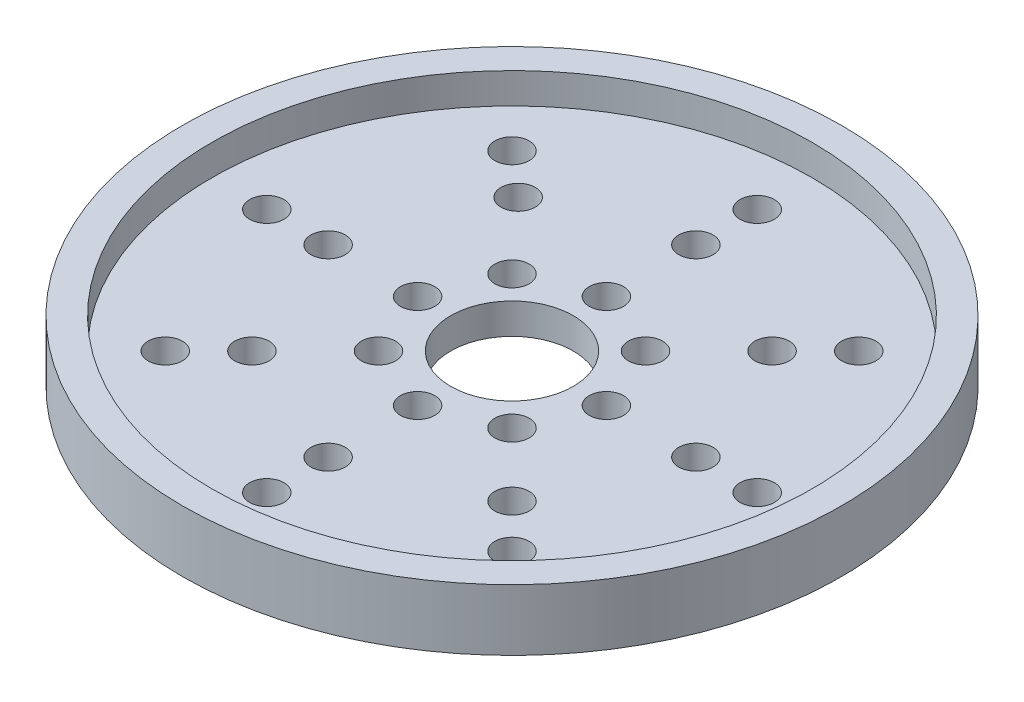
ISO-10303-21;
HEADER;
FILE_DESCRIPTION(('STEP AP214'),'2;1');
FILE_NAME('part.step','',(''),(''),'','','');
FILE_SCHEMA(('AUTOMOTIVE_DESIGN { 1 0 10303 214 1 1 1 1 }'));
ENDSEC;
DATA;
#1=APPLICATION_CONTEXT('core data for automotive mechanical design processes');
#2=APPLICATION_PROTOCOL_DEFINITION('international standard','automotive_design',2000,#1);
#3=PRODUCT_CONTEXT('',#1,'mechanical');
#4=PRODUCT('Part','Part','',(#3));
#5=PRODUCT_RELATED_PRODUCT_CATEGORY('part','',(#4));
#6=PRODUCT_DEFINITION_FORMATION('','',#4);
#7=PRODUCT_DEFINITION_CONTEXT('part definition',#1,'design');
#8=PRODUCT_DEFINITION('design','',#6,#7);
#9=PRODUCT_DEFINITION_SHAPE('','',#8);
#10=(LENGTH_UNIT() NAMED_UNIT(*) SI_UNIT(.MILLI.,.METRE.));
#11=(NAMED_UNIT(*) PLANE_ANGLE_UNIT() SI_UNIT($,.RADIAN.));
#12=(NAMED_UNIT(*) SI_UNIT($,.STERADIAN.) SOLID_ANGLE_UNIT());
#13=UNCERTAINTY_MEASURE_WITH_UNIT(LENGTH_MEASURE(1.E-05),#10,'distance_accuracy_value','');
#14=(GEOMETRIC_REPRESENTATION_CONTEXT(3) GLOBAL_UNCERTAINTY_ASSIGNED_CONTEXT((#13)) GLOBAL_UNIT_ASSIGNED_CONTEXT((#10,
#11,#12)) REPRESENTATION_CONTEXT('',''));
#15=CARTESIAN_POINT('',(0.,0.,0.));
#16=DIRECTION('',(0.,0.,1.));
#17=DIRECTION('',(1.,0.,0.));
#18=AXIS2_PLACEMENT_3D('',#15,#16,#17);
#19=CARTESIAN_POINT('',(0.,6.35,0.));
#20=DIRECTION('',(0.,-1.,0.));
#21=DIRECTION('',(0.,0.,-1.));
#22=AXIS2_PLACEMENT_3D('',#19,#20,#21);
#23=CYLINDRICAL_SURFACE('',#22,34.1376);
#24=CARTESIAN_POINT('',(0.,6.35,0.));
#25=DIRECTION('',(0.,1.,0.));
#26=DIRECTION('',(0.,0.,1.));
#27=AXIS2_PLACEMENT_3D('',#24,#25,#26);
#28=CIRCLE('',#27,34.1376);
#29=CARTESIAN_POINT('',(0.,6.35,34.1376));
#30=VERTEX_POINT('',#29);
#31=EDGE_CURVE('E10',#30,#30,#28,.T.);
#32=ORIENTED_EDGE('',*,*,#31,.F.);
#33=EDGE_LOOP('',(#32));
#34=FACE_BOUND('',#33,.T.);
#35=CARTESIAN_POINT('',(0.,0.,0.));
#36=DIRECTION('',(0.,1.,0.));
#37=DIRECTION('',(0.,0.,1.));
#38=AXIS2_PLACEMENT_3D('',#35,#36,#37);
#39=CIRCLE('',#38,34.1376);
#40=CARTESIAN_POINT('',(0.,0.,34.1376));
#41=VERTEX_POINT('',#40);
#42=EDGE_CURVE('E34',#41,#41,#39,.T.);
#43=ORIENTED_EDGE('',*,*,#42,.T.);
#44=EDGE_LOOP('',(#43));
#45=FACE_BOUND('',#44,.T.);
#46=ADVANCED_FACE('F31',(#34,#45),#23,.T.);
#47=CARTESIAN_POINT('',(0.,6.35,0.));
#48=DIRECTION('',(0.,1.,0.));
#49=DIRECTION('',(0.,0.,1.));
#50=AXIS2_PLACEMENT_3D('',#47,#48,#49);
#51=PLANE('',#50);
#52=CARTESIAN_POINT('',(0.,6.35,0.));
#53=DIRECTION('',(0.,1.,0.));
#54=DIRECTION('',(0.,0.,1.));
#55=AXIS2_PLACEMENT_3D('',#52,#53,#54);
#56=CIRCLE('',#55,31.0896);
#57=CARTESIAN_POINT('',(0.,6.35,31.0896));
#58=VERTEX_POINT('',#57);
#59=EDGE_CURVE('E43',#58,#58,#56,.T.);
#60=ORIENTED_EDGE('',*,*,#59,.F.);
#61=EDGE_LOOP('',(#60));
#62=FACE_BOUND('',#61,.T.);
#63=ORIENTED_EDGE('',*,*,#31,.T.);
#64=EDGE_LOOP('',(#63));
#65=FACE_BOUND('',#64,.T.);
#66=ADVANCED_FACE('F270',(#62,#65),#51,.T.);
#67=CARTESIAN_POINT('',(0.,0.,0.));
#68=DIRECTION('',(0.,1.,0.));
#69=DIRECTION('',(0.,0.,1.));
#70=AXIS2_PLACEMENT_3D('',#67,#68,#69);
#71=PLANE('',#70);
#72=CARTESIAN_POINT('',(6.91479721322325,0.,6.91479721322325));
#73=DIRECTION('',(0.,1.,0.));
#74=DIRECTION('',(0.,0.,1.));
#75=AXIS2_PLACEMENT_3D('',#72,#73,#74);
#76=CIRCLE('',#75,1.778);
#77=CARTESIAN_POINT('',(6.91479721322325,0.,8.69279721322325));
#78=VERTEX_POINT('',#77);
#79=EDGE_CURVE('E190',#78,#78,#76,.T.);
#80=ORIENTED_EDGE('',*,*,#79,.T.);
#81=EDGE_LOOP('',(#80));
#82=FACE_BOUND('',#81,.T.);
#83=CARTESIAN_POINT('',(0.,0.,9.779));
#84=DIRECTION('',(0.,1.,0.));
#85=DIRECTION('',(0.,0.,1.));
#86=AXIS2_PLACEMENT_3D('',#83,#84,#85);
#87=CIRCLE('',#86,1.778);
#88=CARTESIAN_POINT('',(0.,0.,11.557));
#89=VERTEX_POINT('',#88);
#90=EDGE_CURVE('E184',#89,#89,#87,.T.);
#91=ORIENTED_EDGE('',*,*,#90,.T.);
#92=EDGE_LOOP('',(#91));
#93=FACE_BOUND('',#92,.T.);
#94=CARTESIAN_POINT('',(-6.91479721322325,0.,6.91479721322325));
#95=DIRECTION('',(0.,1.,0.));
#96=DIRECTION('',(0.,0.,1.));
#97=AXIS2_PLACEMENT_3D('',#94,#95,#96);
#98=CIRCLE('',#97,1.778);
#99=CARTESIAN_POINT('',(-6.91479721322325,0.,8.69279721322325));
#100=VERTEX_POINT('',#99);
#101=EDGE_CURVE('E178',#100,#100,#98,.T.);
#102=ORIENTED_EDGE('',*,*,#101,.T.);
#103=EDGE_LOOP('',(#102));
#104=FACE_BOUND('',#103,.T.);
#105=CARTESIAN_POINT('',(-9.779,0.,0.));
#106=DIRECTION('',(0.,1.,0.));
#107=DIRECTION('',(0.,0.,1.));
#108=AXIS2_PLACEMENT_3D('',#105,#106,#107);
#109=CIRCLE('',#108,1.778);
#110=CARTESIAN_POINT('',(-9.779,0.,1.778));
#111=VERTEX_POINT('',#110);
#112=EDGE_CURVE('E172',#111,#111,#109,.T.);
#113=ORIENTED_EDGE('',*,*,#112,.T.);
#114=EDGE_LOOP('',(#113));
#115=FACE_BOUND('',#114,.T.);
#116=CARTESIAN_POINT('',(-6.91479721322325,0.,-6.91479721322325));
#117=DIRECTION('',(0.,1.,0.));
#118=DIRECTION('',(0.,0.,1.));
#119=AXIS2_PLACEMENT_3D('',#116,#117,#118);
#120=CIRCLE('',#119,1.778);
#121=CARTESIAN_POINT('',(-6.91479721322325,0.,-5.13679721322325));
#122=VERTEX_POINT('',#121);
#123=EDGE_CURVE('E166',#122,#122,#120,.T.);
#124=ORIENTED_EDGE('',*,*,#123,.T.);
#125=EDGE_LOOP('',(#124));
#126=FACE_BOUND('',#125,.T.);
#127=CARTESIAN_POINT('',(0.,0.,-9.779));
#128=DIRECTION('',(0.,1.,0.));
#129=DIRECTION('',(0.,0.,1.));
#130=AXIS2_PLACEMENT_3D('',#127,#128,#129);
#131=CIRCLE('',#130,1.778);
#132=CARTESIAN_POINT('',(0.,0.,-8.001));
#133=VERTEX_POINT('',#132);
#134=EDGE_CURVE('E160',#133,#133,#131,.T.);
#135=ORIENTED_EDGE('',*,*,#134,.T.);
#136=EDGE_LOOP('',(#135));
#137=FACE_BOUND('',#136,.T.);
#138=CARTESIAN_POINT('',(6.91479721322325,0.,-6.91479721322325));
#139=DIRECTION('',(0.,1.,0.));
#140=DIRECTION('',(0.,0.,1.));
#141=AXIS2_PLACEMENT_3D('',#138,#139,#140);
#142=CIRCLE('',#141,1.778);
#143=CARTESIAN_POINT('',(6.91479721322325,0.,-5.13679721322325));
#144=VERTEX_POINT('',#143);
#145=EDGE_CURVE('E154',#144,#144,#142,.T.);
#146=ORIENTED_EDGE('',*,*,#145,.T.);
#147=EDGE_LOOP('',(#146));
#148=FACE_BOUND('',#147,.T.);
#149=CARTESIAN_POINT('',(9.779,0.,0.));
#150=DIRECTION('',(0.,1.,0.));
#151=DIRECTION('',(0.,0.,1.));
#152=AXIS2_PLACEMENT_3D('',#149,#150,#151);
#153=CIRCLE('',#152,1.778);
#154=CARTESIAN_POINT('',(9.779,0.,1.778));
#155=VERTEX_POINT('',#154);
#156=EDGE_CURVE('E148',#155,#155,#153,.T.);
#157=ORIENTED_EDGE('',*,*,#156,.T.);
#158=EDGE_LOOP('',(#157));
#159=FACE_BOUND('',#158,.T.);
#160=CARTESIAN_POINT('',(13.4703841816037,0.,-13.4703841816037));
#161=DIRECTION('',(0.,1.,0.));
#162=DIRECTION('',(0.,0.,1.));
#163=AXIS2_PLACEMENT_3D('',#160,#161,#162);
#164=CIRCLE('',#163,1.778);
#165=CARTESIAN_POINT('',(13.4703841816037,0.,-11.6923841816037));
#166=VERTEX_POINT('',#165);
#167=EDGE_CURVE('E142',#166,#166,#164,.T.);
#168=ORIENTED_EDGE('',*,*,#167,.T.);
#169=EDGE_LOOP('',(#168));
#170=FACE_BOUND('',#169,.T.);
#171=CARTESIAN_POINT('',(19.05,0.,0.));
#172=DIRECTION('',(0.,1.,0.));
#173=DIRECTION('',(0.,0.,1.));
#174=AXIS2_PLACEMENT_3D('',#171,#172,#173);
#175=CIRCLE('',#174,1.778);
#176=CARTESIAN_POINT('',(19.05,0.,1.778));
#177=VERTEX_POINT('',#176);
#178=EDGE_CURVE('E136',#177,#177,#175,.T.);
#179=ORIENTED_EDGE('',*,*,#178,.T.);
#180=EDGE_LOOP('',(#179));
#181=FACE_BOUND('',#180,.T.);
#182=CARTESIAN_POINT('',(13.4703841816037,0.,13.4703841816037));
#183=DIRECTION('',(0.,1.,0.));
#184=DIRECTION('',(0.,0.,1.));
#185=AXIS2_PLACEMENT_3D('',#182,#183,#184);
#186=CIRCLE('',#185,1.778);
#187=CARTESIAN_POINT('',(13.4703841816037,0.,15.2483841816037));
#188=VERTEX_POINT('',#187);
#189=EDGE_CURVE('E130',#188,#188,#186,.T.);
#190=ORIENTED_EDGE('',*,*,#189,.T.);
#191=EDGE_LOOP('',(#190));
#192=FACE_BOUND('',#191,.T.);
#193=CARTESIAN_POINT('',(0.,0.,19.05));
#194=DIRECTION('',(0.,1.,0.));
#195=DIRECTION('',(0.,0.,1.));
#196=AXIS2_PLACEMENT_3D('',#193,#194,#195);
#197=CIRCLE('',#196,1.778);
#198=CARTESIAN_POINT('',(0.,0.,20.828));
#199=VERTEX_POINT('',#198);
#200=EDGE_CURVE('E124',#199,#199,#197,.T.);
#201=ORIENTED_EDGE('',*,*,#200,.T.);
#202=EDGE_LOOP('',(#201));
#203=FACE_BOUND('',#202,.T.);
#204=CARTESIAN_POINT('',(-13.4703841816037,0.,13.4703841816037));
#205=DIRECTION('',(0.,1.,0.));
#206=DIRECTION('',(0.,0.,1.));
#207=AXIS2_PLACEMENT_3D('',#204,#205,#206);
#208=CIRCLE('',#207,1.778);
#209=CARTESIAN_POINT('',(-13.4703841816037,0.,15.2483841816037));
#210=VERTEX_POINT('',#209);
#211=EDGE_CURVE('E118',#210,#210,#208,.T.);
#212=ORIENTED_EDGE('',*,*,#211,.T.);
#213=EDGE_LOOP('',(#212));
#214=FACE_BOUND('',#213,.T.);
#215=CARTESIAN_POINT('',(-19.05,0.,0.));
#216=DIRECTION('',(0.,1.,0.));
#217=DIRECTION('',(0.,0.,1.));
#218=AXIS2_PLACEMENT_3D('',#215,#216,#217);
#219=CIRCLE('',#218,1.778);
#220=CARTESIAN_POINT('',(-19.05,0.,1.778));
#221=VERTEX_POINT('',#220);
#222=EDGE_CURVE('E112',#221,#221,#219,.T.);
#223=ORIENTED_EDGE('',*,*,#222,.T.);
#224=EDGE_LOOP('',(#223));
#225=FACE_BOUND('',#224,.T.);
#226=CARTESIAN_POINT('',(-13.4703841816037,0.,-14.1089661095624));
#227=DIRECTION('',(0.,1.,0.));
#228=DIRECTION('',(0.,0.,1.));
#229=AXIS2_PLACEMENT_3D('',#226,#227,#228);
#230=CIRCLE('',#229,1.778);
#231=CARTESIAN_POINT('',(-13.4703841816037,0.,-12.3309661095624));
#232=VERTEX_POINT('',#231);
#233=EDGE_CURVE('E106',#232,#232,#230,.T.);
#234=ORIENTED_EDGE('',*,*,#233,.T.);
#235=EDGE_LOOP('',(#234));
#236=FACE_BOUND('',#235,.T.);
#237=CARTESIAN_POINT('',(0.,0.,-19.05));
#238=DIRECTION('',(0.,1.,0.));
#239=DIRECTION('',(0.,0.,1.));
#240=AXIS2_PLACEMENT_3D('',#237,#238,#239);
#241=CIRCLE('',#240,1.778);
#242=CARTESIAN_POINT('',(0.,0.,-17.272));
#243=VERTEX_POINT('',#242);
#244=EDGE_CURVE('E100',#243,#243,#241,.T.);
#245=ORIENTED_EDGE('',*,*,#244,.T.);
#246=EDGE_LOOP('',(#245));
#247=FACE_BOUND('',#246,.T.);
#248=CARTESIAN_POINT('',(17.9605122421383,0.,17.9605122421383));
#249=DIRECTION('',(0.,1.,0.));
#250=DIRECTION('',(0.,0.,1.));
#251=AXIS2_PLACEMENT_3D('',#248,#249,#250);
#252=CIRCLE('',#251,1.778);
#253=CARTESIAN_POINT('',(17.9605122421383,0.,19.7385122421383));
#254=VERTEX_POINT('',#253);
#255=EDGE_CURVE('E94',#254,#254,#252,.T.);
#256=ORIENTED_EDGE('',*,*,#255,.T.);
#257=EDGE_LOOP('',(#256));
#258=FACE_BOUND('',#257,.T.);
#259=CARTESIAN_POINT('',(0.,0.,25.4));
#260=DIRECTION('',(0.,1.,0.));
#261=DIRECTION('',(0.,0.,1.));
#262=AXIS2_PLACEMENT_3D('',#259,#260,#261);
#263=CIRCLE('',#262,1.778);
#264=CARTESIAN_POINT('',(0.,0.,27.178));
#265=VERTEX_POINT('',#264);
#266=EDGE_CURVE('E88',#265,#265,#263,.T.);
#267=ORIENTED_EDGE('',*,*,#266,.T.);
#268=EDGE_LOOP('',(#267));
#269=FACE_BOUND('',#268,.T.);
#270=CARTESIAN_POINT('',(-17.9605122421383,0.,17.9605122421383));
#271=DIRECTION('',(0.,1.,0.));
#272=DIRECTION('',(0.,0.,1.));
#273=AXIS2_PLACEMENT_3D('',#270,#271,#272);
#274=CIRCLE('',#273,1.778);
#275=CARTESIAN_POINT('',(-17.9605122421383,0.,19.7385122421383));
#276=VERTEX_POINT('',#275);
#277=EDGE_CURVE('E82',#276,#276,#274,.T.);
#278=ORIENTED_EDGE('',*,*,#277,.T.);
#279=EDGE_LOOP('',(#278));
#280=FACE_BOUND('',#279,.T.);
#281=CARTESIAN_POINT('',(-25.4,0.,0.));
#282=DIRECTION('',(0.,1.,0.));
#283=DIRECTION('',(0.,0.,1.));
#284=AXIS2_PLACEMENT_3D('',#281,#282,#283);
#285=CIRCLE('',#284,1.778);
#286=CARTESIAN_POINT('',(-25.4,0.,1.77800000000001));
#287=VERTEX_POINT('',#286);
#288=EDGE_CURVE('E76',#287,#287,#285,.T.);
#289=ORIENTED_EDGE('',*,*,#288,.T.);
#290=EDGE_LOOP('',(#289));
#291=FACE_BOUND('',#290,.T.);
#292=CARTESIAN_POINT('',(-17.9605122421383,0.,-17.9605122421383));
#293=DIRECTION('',(0.,1.,0.));
#294=DIRECTION('',(0.,0.,1.));
#295=AXIS2_PLACEMENT_3D('',#292,#293,#294);
#296=CIRCLE('',#295,1.778);
#297=CARTESIAN_POINT('',(-17.9605122421383,0.,-16.1825122421383));
#298=VERTEX_POINT('',#297);
#299=EDGE_CURVE('E70',#298,#298,#296,.T.);
#300=ORIENTED_EDGE('',*,*,#299,.T.);
#301=EDGE_LOOP('',(#300));
#302=FACE_BOUND('',#301,.T.);
#303=CARTESIAN_POINT('',(0.,0.,-25.4));
#304=DIRECTION('',(0.,1.,0.));
#305=DIRECTION('',(0.,0.,1.));
#306=AXIS2_PLACEMENT_3D('',#303,#304,#305);
#307=CIRCLE('',#306,1.778);
#308=CARTESIAN_POINT('',(0.,0.,-23.622));
#309=VERTEX_POINT('',#308);
#310=EDGE_CURVE('E64',#309,#309,#307,.T.);
#311=ORIENTED_EDGE('',*,*,#310,.T.);
#312=EDGE_LOOP('',(#311));
#313=FACE_BOUND('',#312,.T.);
#314=CARTESIAN_POINT('',(17.9605122421383,0.,-17.9605122421383));
#315=DIRECTION('',(0.,1.,0.));
#316=DIRECTION('',(0.,0.,1.));
#317=AXIS2_PLACEMENT_3D('',#314,#315,#316);
#318=CIRCLE('',#317,1.778);
#319=CARTESIAN_POINT('',(17.9605122421383,0.,-16.1825122421383));
#320=VERTEX_POINT('',#319);
#321=EDGE_CURVE('E58',#320,#320,#318,.T.);
#322=ORIENTED_EDGE('',*,*,#321,.T.);
#323=EDGE_LOOP('',(#322));
#324=FACE_BOUND('',#323,.T.);
#325=CARTESIAN_POINT('',(25.4,0.,0.));
#326=DIRECTION('',(0.,1.,0.));
#327=DIRECTION('',(0.,0.,1.));
#328=AXIS2_PLACEMENT_3D('',#325,#326,#327);
#329=CIRCLE('',#328,1.778);
#330=CARTESIAN_POINT('',(25.4,0.,1.778));
#331=VERTEX_POINT('',#330);
#332=EDGE_CURVE('E52',#331,#331,#329,.T.);
#333=ORIENTED_EDGE('',*,*,#332,.T.);
#334=EDGE_LOOP('',(#333));
#335=FACE_BOUND('',#334,.T.);
#336=CARTESIAN_POINT('',(0.,0.,0.));
#337=DIRECTION('',(0.,1.,0.));
#338=DIRECTION('',(0.,0.,1.));
#339=AXIS2_PLACEMENT_3D('',#336,#337,#338);
#340=CIRCLE('',#339,6.35);
#341=CARTESIAN_POINT('',(0.,0.,6.35));
#342=VERTEX_POINT('',#341);
#343=EDGE_CURVE('E46',#342,#342,#340,.T.);
#344=ORIENTED_EDGE('',*,*,#343,.T.);
#345=EDGE_LOOP('',(#344));
#346=FACE_BOUND('',#345,.T.);
#347=ORIENTED_EDGE('',*,*,#42,.F.);
#348=EDGE_LOOP('',(#347));
#349=FACE_BOUND('',#348,.T.);
#350=ADVANCED_FACE('F199',(#82,#93,#104,#115,#126,#137,#148,#159,#170,#181,#192,#203,#214,#225,
#236,#247,#258,#269,#280,#291,#302,#313,#324,#335,#346,#349),#71,.F.);
#351=CARTESIAN_POINT('',(0.,3.175,0.));
#352=DIRECTION('',(0.,1.,0.));
#353=DIRECTION('',(0.,0.,1.));
#354=AXIS2_PLACEMENT_3D('',#351,#352,#353);
#355=CYLINDRICAL_SURFACE('',#354,31.0896);
#356=CARTESIAN_POINT('',(0.,3.175,0.));
#357=DIRECTION('',(0.,1.,0.));
#358=DIRECTION('',(0.,0.,1.));
#359=AXIS2_PLACEMENT_3D('',#356,#357,#358);
#360=CIRCLE('',#359,31.0896);
#361=CARTESIAN_POINT('',(0.,3.175,31.0896));
#362=VERTEX_POINT('',#361);
#363=EDGE_CURVE('E41',#362,#362,#360,.T.);
#364=ORIENTED_EDGE('',*,*,#363,.F.);
#365=EDGE_LOOP('',(#364));
#366=FACE_BOUND('',#365,.T.);
#367=ORIENTED_EDGE('',*,*,#59,.T.);
#368=EDGE_LOOP('',(#367));
#369=FACE_BOUND('',#368,.T.);
#370=ADVANCED_FACE('F213',(#366,#369),#355,.F.);
#371=CARTESIAN_POINT('',(0.,3.175,0.));
#372=DIRECTION('',(0.,1.,0.));
#373=DIRECTION('',(0.,0.,1.));
#374=AXIS2_PLACEMENT_3D('',#371,#372,#373);
#375=PLANE('',#374);
#376=CARTESIAN_POINT('',(6.91479721322325,3.175,6.91479721322325));
#377=DIRECTION('',(0.,1.,0.));
#378=DIRECTION('',(0.,0.,1.));
#379=AXIS2_PLACEMENT_3D('',#376,#377,#378);
#380=CIRCLE('',#379,1.778);
#381=CARTESIAN_POINT('',(6.91479721322325,3.175,8.69279721322325));
#382=VERTEX_POINT('',#381);
#383=EDGE_CURVE('E193',#382,#382,#380,.T.);
#384=ORIENTED_EDGE('',*,*,#383,.F.);
#385=EDGE_LOOP('',(#384));
#386=FACE_BOUND('',#385,.T.);
#387=CARTESIAN_POINT('',(0.,3.175,9.779));
#388=DIRECTION('',(0.,1.,0.));
#389=DIRECTION('',(0.,0.,1.));
#390=AXIS2_PLACEMENT_3D('',#387,#388,#389);
#391=CIRCLE('',#390,1.778);
#392=CARTESIAN_POINT('',(0.,3.175,11.557));
#393=VERTEX_POINT('',#392);
#394=EDGE_CURVE('E187',#393,#393,#391,.T.);
#395=ORIENTED_EDGE('',*,*,#394,.F.);
#396=EDGE_LOOP('',(#395));
#397=FACE_BOUND('',#396,.T.);
#398=CARTESIAN_POINT('',(-6.91479721322325,3.175,6.91479721322325));
#399=DIRECTION('',(0.,1.,0.));
#400=DIRECTION('',(0.,0.,1.));
#401=AXIS2_PLACEMENT_3D('',#398,#399,#400);
#402=CIRCLE('',#401,1.778);
#403=CARTESIAN_POINT('',(-6.91479721322325,3.175,8.69279721322325));
#404=VERTEX_POINT('',#403);
#405=EDGE_CURVE('E181',#404,#404,#402,.T.);
#406=ORIENTED_EDGE('',*,*,#405,.F.);
#407=EDGE_LOOP('',(#406));
#408=FACE_BOUND('',#407,.T.);
#409=CARTESIAN_POINT('',(-9.779,3.175,0.));
#410=DIRECTION('',(0.,1.,0.));
#411=DIRECTION('',(0.,0.,1.));
#412=AXIS2_PLACEMENT_3D('',#409,#410,#411);
#413=CIRCLE('',#412,1.778);
#414=CARTESIAN_POINT('',(-9.779,3.175,1.778));
#415=VERTEX_POINT('',#414);
#416=EDGE_CURVE('E175',#415,#415,#413,.T.);
#417=ORIENTED_EDGE('',*,*,#416,.F.);
#418=EDGE_LOOP('',(#417));
#419=FACE_BOUND('',#418,.T.);
#420=CARTESIAN_POINT('',(-6.91479721322325,3.175,-6.91479721322325));
#421=DIRECTION('',(0.,1.,0.));
#422=DIRECTION('',(0.,0.,1.));
#423=AXIS2_PLACEMENT_3D('',#420,#421,#422);
#424=CIRCLE('',#423,1.778);
#425=CARTESIAN_POINT('',(-6.91479721322325,3.175,-5.13679721322325));
#426=VERTEX_POINT('',#425);
#427=EDGE_CURVE('E169',#426,#426,#424,.T.);
#428=ORIENTED_EDGE('',*,*,#427,.F.);
#429=EDGE_LOOP('',(#428));
#430=FACE_BOUND('',#429,.T.);
#431=CARTESIAN_POINT('',(0.,3.175,-9.779));
#432=DIRECTION('',(0.,1.,0.));
#433=DIRECTION('',(0.,0.,1.));
#434=AXIS2_PLACEMENT_3D('',#431,#432,#433);
#435=CIRCLE('',#434,1.778);
#436=CARTESIAN_POINT('',(0.,3.175,-8.001));
#437=VERTEX_POINT('',#436);
#438=EDGE_CURVE('E163',#437,#437,#435,.T.);
#439=ORIENTED_EDGE('',*,*,#438,.F.);
#440=EDGE_LOOP('',(#439));
#441=FACE_BOUND('',#440,.T.);
#442=CARTESIAN_POINT('',(6.91479721322325,3.175,-6.91479721322325));
#443=DIRECTION('',(0.,1.,0.));
#444=DIRECTION('',(0.,0.,1.));
#445=AXIS2_PLACEMENT_3D('',#442,#443,#444);
#446=CIRCLE('',#445,1.778);
#447=CARTESIAN_POINT('',(6.91479721322325,3.175,-5.13679721322325));
#448=VERTEX_POINT('',#447);
#449=EDGE_CURVE('E157',#448,#448,#446,.T.);
#450=ORIENTED_EDGE('',*,*,#449,.F.);
#451=EDGE_LOOP('',(#450));
#452=FACE_BOUND('',#451,.T.);
#453=CARTESIAN_POINT('',(9.779,3.175,0.));
#454=DIRECTION('',(0.,1.,0.));
#455=DIRECTION('',(0.,0.,1.));
#456=AXIS2_PLACEMENT_3D('',#453,#454,#455);
#457=CIRCLE('',#456,1.778);
#458=CARTESIAN_POINT('',(9.779,3.175,1.778));
#459=VERTEX_POINT('',#458);
#460=EDGE_CURVE('E151',#459,#459,#457,.T.);
#461=ORIENTED_EDGE('',*,*,#460,.F.);
#462=EDGE_LOOP('',(#461));
#463=FACE_BOUND('',#462,.T.);
#464=CARTESIAN_POINT('',(13.4703841816037,3.175,-13.4703841816037));
#465=DIRECTION('',(0.,1.,0.));
#466=DIRECTION('',(0.,0.,1.));
#467=AXIS2_PLACEMENT_3D('',#464,#465,#466);
#468=CIRCLE('',#467,1.778);
#469=CARTESIAN_POINT('',(13.4703841816037,3.175,-11.6923841816037));
#470=VERTEX_POINT('',#469);
#471=EDGE_CURVE('E145',#470,#470,#468,.T.);
#472=ORIENTED_EDGE('',*,*,#471,.F.);
#473=EDGE_LOOP('',(#472));
#474=FACE_BOUND('',#473,.T.);
#475=CARTESIAN_POINT('',(19.05,3.175,0.));
#476=DIRECTION('',(0.,1.,0.));
#477=DIRECTION('',(0.,0.,1.));
#478=AXIS2_PLACEMENT_3D('',#475,#476,#477);
#479=CIRCLE('',#478,1.778);
#480=CARTESIAN_POINT('',(19.05,3.175,1.778));
#481=VERTEX_POINT('',#480);
#482=EDGE_CURVE('E139',#481,#481,#479,.T.);
#483=ORIENTED_EDGE('',*,*,#482,.F.);
#484=EDGE_LOOP('',(#483));
#485=FACE_BOUND('',#484,.T.);
#486=CARTESIAN_POINT('',(13.4703841816037,3.175,13.4703841816037));
#487=DIRECTION('',(0.,1.,0.));
#488=DIRECTION('',(0.,0.,1.));
#489=AXIS2_PLACEMENT_3D('',#486,#487,#488);
#490=CIRCLE('',#489,1.778);
#491=CARTESIAN_POINT('',(13.4703841816037,3.175,15.2483841816037));
#492=VERTEX_POINT('',#491);
#493=EDGE_CURVE('E133',#492,#492,#490,.T.);
#494=ORIENTED_EDGE('',*,*,#493,.F.);
#495=EDGE_LOOP('',(#494));
#496=FACE_BOUND('',#495,.T.);
#497=CARTESIAN_POINT('',(0.,3.175,19.05));
#498=DIRECTION('',(0.,1.,0.));
#499=DIRECTION('',(0.,0.,1.));
#500=AXIS2_PLACEMENT_3D('',#497,#498,#499);
#501=CIRCLE('',#500,1.778);
#502=CARTESIAN_POINT('',(0.,3.175,20.828));
#503=VERTEX_POINT('',#502);
#504=EDGE_CURVE('E127',#503,#503,#501,.T.);
#505=ORIENTED_EDGE('',*,*,#504,.F.);
#506=EDGE_LOOP('',(#505));
#507=FACE_BOUND('',#506,.T.);
#508=CARTESIAN_POINT('',(-13.4703841816037,3.175,13.4703841816037));
#509=DIRECTION('',(0.,1.,0.));
#510=DIRECTION('',(0.,0.,1.));
#511=AXIS2_PLACEMENT_3D('',#508,#509,#510);
#512=CIRCLE('',#511,1.778);
#513=CARTESIAN_POINT('',(-13.4703841816037,3.175,15.2483841816037));
#514=VERTEX_POINT('',#513);
#515=EDGE_CURVE('E121',#514,#514,#512,.T.);
#516=ORIENTED_EDGE('',*,*,#515,.F.);
#517=EDGE_LOOP('',(#516));
#518=FACE_BOUND('',#517,.T.);
#519=CARTESIAN_POINT('',(-19.05,3.175,0.));
#520=DIRECTION('',(0.,1.,0.));
#521=DIRECTION('',(0.,0.,1.));
#522=AXIS2_PLACEMENT_3D('',#519,#520,#521);
#523=CIRCLE('',#522,1.778);
#524=CARTESIAN_POINT('',(-19.05,3.175,1.778));
#525=VERTEX_POINT('',#524);
#526=EDGE_CURVE('E115',#525,#525,#523,.T.);
#527=ORIENTED_EDGE('',*,*,#526,.F.);
#528=EDGE_LOOP('',(#527));
#529=FACE_BOUND('',#528,.T.);
#530=CARTESIAN_POINT('',(-13.4703841816037,3.175,-14.1089661095624));
#531=DIRECTION('',(0.,1.,0.));
#532=DIRECTION('',(0.,0.,1.));
#533=AXIS2_PLACEMENT_3D('',#530,#531,#532);
#534=CIRCLE('',#533,1.778);
#535=CARTESIAN_POINT('',(-13.4703841816037,3.175,-12.3309661095624));
#536=VERTEX_POINT('',#535);
#537=EDGE_CURVE('E109',#536,#536,#534,.T.);
#538=ORIENTED_EDGE('',*,*,#537,.F.);
#539=EDGE_LOOP('',(#538));
#540=FACE_BOUND('',#539,.T.);
#541=CARTESIAN_POINT('',(0.,3.175,-19.05));
#542=DIRECTION('',(0.,1.,0.));
#543=DIRECTION('',(0.,0.,1.));
#544=AXIS2_PLACEMENT_3D('',#541,#542,#543);
#545=CIRCLE('',#544,1.778);
#546=CARTESIAN_POINT('',(0.,3.175,-17.272));
#547=VERTEX_POINT('',#546);
#548=EDGE_CURVE('E103',#547,#547,#545,.T.);
#549=ORIENTED_EDGE('',*,*,#548,.F.);
#550=EDGE_LOOP('',(#549));
#551=FACE_BOUND('',#550,.T.);
#552=CARTESIAN_POINT('',(17.9605122421383,3.175,17.9605122421383));
#553=DIRECTION('',(0.,1.,0.));
#554=DIRECTION('',(0.,0.,1.));
#555=AXIS2_PLACEMENT_3D('',#552,#553,#554);
#556=CIRCLE('',#555,1.778);
#557=CARTESIAN_POINT('',(17.9605122421383,3.175,19.7385122421383));
#558=VERTEX_POINT('',#557);
#559=EDGE_CURVE('E97',#558,#558,#556,.T.);
#560=ORIENTED_EDGE('',*,*,#559,.F.);
#561=EDGE_LOOP('',(#560));
#562=FACE_BOUND('',#561,.T.);
#563=CARTESIAN_POINT('',(0.,3.175,25.4));
#564=DIRECTION('',(0.,1.,0.));
#565=DIRECTION('',(0.,0.,1.));
#566=AXIS2_PLACEMENT_3D('',#563,#564,#565);
#567=CIRCLE('',#566,1.778);
#568=CARTESIAN_POINT('',(0.,3.175,27.178));
#569=VERTEX_POINT('',#568);
#570=EDGE_CURVE('E91',#569,#569,#567,.T.);
#571=ORIENTED_EDGE('',*,*,#570,.F.);
#572=EDGE_LOOP('',(#571));
#573=FACE_BOUND('',#572,.T.);
#574=CARTESIAN_POINT('',(-17.9605122421383,3.175,17.9605122421383));
#575=DIRECTION('',(0.,1.,0.));
#576=DIRECTION('',(0.,0.,1.));
#577=AXIS2_PLACEMENT_3D('',#574,#575,#576);
#578=CIRCLE('',#577,1.778);
#579=CARTESIAN_POINT('',(-17.9605122421383,3.175,19.7385122421383));
#580=VERTEX_POINT('',#579);
#581=EDGE_CURVE('E85',#580,#580,#578,.T.);
#582=ORIENTED_EDGE('',*,*,#581,.F.);
#583=EDGE_LOOP('',(#582));
#584=FACE_BOUND('',#583,.T.);
#585=CARTESIAN_POINT('',(-25.4,3.175,0.));
#586=DIRECTION('',(0.,1.,0.));
#587=DIRECTION('',(0.,0.,1.));
#588=AXIS2_PLACEMENT_3D('',#585,#586,#587);
#589=CIRCLE('',#588,1.778);
#590=CARTESIAN_POINT('',(-25.4,3.175,1.77800000000001));
#591=VERTEX_POINT('',#590);
#592=EDGE_CURVE('E79',#591,#591,#589,.T.);
#593=ORIENTED_EDGE('',*,*,#592,.F.);
#594=EDGE_LOOP('',(#593));
#595=FACE_BOUND('',#594,.T.);
#596=CARTESIAN_POINT('',(-17.9605122421383,3.175,-17.9605122421383));
#597=DIRECTION('',(0.,1.,0.));
#598=DIRECTION('',(0.,0.,1.));
#599=AXIS2_PLACEMENT_3D('',#596,#597,#598);
#600=CIRCLE('',#599,1.778);
#601=CARTESIAN_POINT('',(-17.9605122421383,3.175,-16.1825122421383));
#602=VERTEX_POINT('',#601);
#603=EDGE_CURVE('E73',#602,#602,#600,.T.);
#604=ORIENTED_EDGE('',*,*,#603,.F.);
#605=EDGE_LOOP('',(#604));
#606=FACE_BOUND('',#605,.T.);
#607=CARTESIAN_POINT('',(0.,3.175,-25.4));
#608=DIRECTION('',(0.,1.,0.));
#609=DIRECTION('',(0.,0.,1.));
#610=AXIS2_PLACEMENT_3D('',#607,#608,#609);
#611=CIRCLE('',#610,1.778);
#612=CARTESIAN_POINT('',(0.,3.175,-23.622));
#613=VERTEX_POINT('',#612);
#614=EDGE_CURVE('E67',#613,#613,#611,.T.);
#615=ORIENTED_EDGE('',*,*,#614,.F.);
#616=EDGE_LOOP('',(#615));
#617=FACE_BOUND('',#616,.T.);
#618=CARTESIAN_POINT('',(17.9605122421383,3.175,-17.9605122421383));
#619=DIRECTION('',(0.,1.,0.));
#620=DIRECTION('',(0.,0.,1.));
#621=AXIS2_PLACEMENT_3D('',#618,#619,#620);
#622=CIRCLE('',#621,1.778);
#623=CARTESIAN_POINT('',(17.9605122421383,3.175,-16.1825122421383));
#624=VERTEX_POINT('',#623);
#625=EDGE_CURVE('E61',#624,#624,#622,.T.);
#626=ORIENTED_EDGE('',*,*,#625,.F.);
#627=EDGE_LOOP('',(#626));
#628=FACE_BOUND('',#627,.T.);
#629=CARTESIAN_POINT('',(25.4,3.175,0.));
#630=DIRECTION('',(0.,1.,0.));
#631=DIRECTION('',(0.,0.,1.));
#632=AXIS2_PLACEMENT_3D('',#629,#630,#631);
#633=CIRCLE('',#632,1.778);
#634=CARTESIAN_POINT('',(25.4,3.175,1.778));
#635=VERTEX_POINT('',#634);
#636=EDGE_CURVE('E55',#635,#635,#633,.T.);
#637=ORIENTED_EDGE('',*,*,#636,.F.);
#638=EDGE_LOOP('',(#637));
#639=FACE_BOUND('',#638,.T.);
#640=CARTESIAN_POINT('',(0.,3.175,0.));
#641=DIRECTION('',(0.,1.,0.));
#642=DIRECTION('',(0.,0.,1.));
#643=AXIS2_PLACEMENT_3D('',#640,#641,#642);
#644=CIRCLE('',#643,6.35);
#645=CARTESIAN_POINT('',(0.,3.175,6.35));
#646=VERTEX_POINT('',#645);
#647=EDGE_CURVE('E49',#646,#646,#644,.T.);
#648=ORIENTED_EDGE('',*,*,#647,.F.);
#649=EDGE_LOOP('',(#648));
#650=FACE_BOUND('',#649,.T.);
#651=ORIENTED_EDGE('',*,*,#363,.T.);
#652=EDGE_LOOP('',(#651));
#653=FACE_BOUND('',#652,.T.);
#654=ADVANCED_FACE('F209',(#386,#397,#408,#419,#430,#441,#452,#463,#474,#485,#496,#507,#518,
#529,#540,#551,#562,#573,#584,#595,#606,#617,#628,#639,#650,#653),#375,.T.);
#655=CARTESIAN_POINT('',(0.,0.,0.));
#656=DIRECTION('',(0.,1.,0.));
#657=DIRECTION('',(0.,0.,1.));
#658=AXIS2_PLACEMENT_3D('',#655,#656,#657);
#659=CYLINDRICAL_SURFACE('',#658,6.35);
#660=ORIENTED_EDGE('',*,*,#343,.F.);
#661=EDGE_LOOP('',(#660));
#662=FACE_BOUND('',#661,.T.);
#663=ORIENTED_EDGE('',*,*,#647,.T.);
#664=EDGE_LOOP('',(#663));
#665=FACE_BOUND('',#664,.T.);
#666=ADVANCED_FACE('F212',(#662,#665),#659,.F.);
#667=CARTESIAN_POINT('',(25.4,0.,0.));
#668=DIRECTION('',(0.,1.,0.));
#669=DIRECTION('',(0.,0.,1.));
#670=AXIS2_PLACEMENT_3D('',#667,#668,#669);
#671=CYLINDRICAL_SURFACE('',#670,1.778);
#672=ORIENTED_EDGE('',*,*,#332,.F.);
#673=EDGE_LOOP('',(#672));
#674=FACE_BOUND('',#673,.T.);
#675=ORIENTED_EDGE('',*,*,#636,.T.);
#676=EDGE_LOOP('',(#675));
#677=FACE_BOUND('',#676,.T.);
#678=ADVANCED_FACE('F281',(#674,#677),#671,.F.);
#679=CARTESIAN_POINT('',(17.9605122421383,0.,-17.9605122421383));
#680=DIRECTION('',(0.,1.,0.));
#681=DIRECTION('',(0.,0.,1.));
#682=AXIS2_PLACEMENT_3D('',#679,#680,#681);
#683=CYLINDRICAL_SURFACE('',#682,1.778);
#684=ORIENTED_EDGE('',*,*,#321,.F.);
#685=EDGE_LOOP('',(#684));
#686=FACE_BOUND('',#685,.T.);
#687=ORIENTED_EDGE('',*,*,#625,.T.);
#688=EDGE_LOOP('',(#687));
#689=FACE_BOUND('',#688,.T.);
#690=ADVANCED_FACE('F285',(#686,#689),#683,.F.);
#691=CARTESIAN_POINT('',(0.,0.,-25.4));
#692=DIRECTION('',(0.,1.,0.));
#693=DIRECTION('',(0.,0.,1.));
#694=AXIS2_PLACEMENT_3D('',#691,#692,#693);
#695=CYLINDRICAL_SURFACE('',#694,1.778);
#696=ORIENTED_EDGE('',*,*,#310,.F.);
#697=EDGE_LOOP('',(#696));
#698=FACE_BOUND('',#697,.T.);
#699=ORIENTED_EDGE('',*,*,#614,.T.);
#700=EDGE_LOOP('',(#699));
#701=FACE_BOUND('',#700,.T.);
#702=ADVANCED_FACE('F289',(#698,#701),#695,.F.);
#703=CARTESIAN_POINT('',(-17.9605122421383,0.,-17.9605122421383));
#704=DIRECTION('',(0.,1.,0.));
#705=DIRECTION('',(0.,0.,1.));
#706=AXIS2_PLACEMENT_3D('',#703,#704,#705);
#707=CYLINDRICAL_SURFACE('',#706,1.778);
#708=ORIENTED_EDGE('',*,*,#299,.F.);
#709=EDGE_LOOP('',(#708));
#710=FACE_BOUND('',#709,.T.);
#711=ORIENTED_EDGE('',*,*,#603,.T.);
#712=EDGE_LOOP('',(#711));
#713=FACE_BOUND('',#712,.T.);
#714=ADVANCED_FACE('F293',(#710,#713),#707,.F.);
#715=CARTESIAN_POINT('',(-25.4,0.,0.));
#716=DIRECTION('',(0.,1.,0.));
#717=DIRECTION('',(0.,0.,1.));
#718=AXIS2_PLACEMENT_3D('',#715,#716,#717);
#719=CYLINDRICAL_SURFACE('',#718,1.778);
#720=ORIENTED_EDGE('',*,*,#288,.F.);
#721=EDGE_LOOP('',(#720));
#722=FACE_BOUND('',#721,.T.);
#723=ORIENTED_EDGE('',*,*,#592,.T.);
#724=EDGE_LOOP('',(#723));
#725=FACE_BOUND('',#724,.T.);
#726=ADVANCED_FACE('F297',(#722,#725),#719,.F.);
#727=CARTESIAN_POINT('',(-17.9605122421383,0.,17.9605122421383));
#728=DIRECTION('',(0.,1.,0.));
#729=DIRECTION('',(0.,0.,1.));
#730=AXIS2_PLACEMENT_3D('',#727,#728,#729);
#731=CYLINDRICAL_SURFACE('',#730,1.778);
#732=ORIENTED_EDGE('',*,*,#277,.F.);
#733=EDGE_LOOP('',(#732));
#734=FACE_BOUND('',#733,.T.);
#735=ORIENTED_EDGE('',*,*,#581,.T.);
#736=EDGE_LOOP('',(#735));
#737=FACE_BOUND('',#736,.T.);
#738=ADVANCED_FACE('F301',(#734,#737),#731,.F.);
#739=CARTESIAN_POINT('',(0.,0.,25.4));
#740=DIRECTION('',(0.,1.,0.));
#741=DIRECTION('',(0.,0.,1.));
#742=AXIS2_PLACEMENT_3D('',#739,#740,#741);
#743=CYLINDRICAL_SURFACE('',#742,1.778);
#744=ORIENTED_EDGE('',*,*,#266,.F.);
#745=EDGE_LOOP('',(#744));
#746=FACE_BOUND('',#745,.T.);
#747=ORIENTED_EDGE('',*,*,#570,.T.);
#748=EDGE_LOOP('',(#747));
#749=FACE_BOUND('',#748,.T.);
#750=ADVANCED_FACE('F305',(#746,#749),#743,.F.);
#751=CARTESIAN_POINT('',(17.9605122421383,0.,17.9605122421383));
#752=DIRECTION('',(0.,1.,0.));
#753=DIRECTION('',(0.,0.,1.));
#754=AXIS2_PLACEMENT_3D('',#751,#752,#753);
#755=CYLINDRICAL_SURFACE('',#754,1.778);
#756=ORIENTED_EDGE('',*,*,#255,.F.);
#757=EDGE_LOOP('',(#756));
#758=FACE_BOUND('',#757,.T.);
#759=ORIENTED_EDGE('',*,*,#559,.T.);
#760=EDGE_LOOP('',(#759));
#761=FACE_BOUND('',#760,.T.);
#762=ADVANCED_FACE('F309',(#758,#761),#755,.F.);
#763=CARTESIAN_POINT('',(0.,0.,-19.05));
#764=DIRECTION('',(0.,1.,0.));
#765=DIRECTION('',(0.,0.,1.));
#766=AXIS2_PLACEMENT_3D('',#763,#764,#765);
#767=CYLINDRICAL_SURFACE('',#766,1.778);
#768=ORIENTED_EDGE('',*,*,#244,.F.);
#769=EDGE_LOOP('',(#768));
#770=FACE_BOUND('',#769,.T.);
#771=ORIENTED_EDGE('',*,*,#548,.T.);
#772=EDGE_LOOP('',(#771));
#773=FACE_BOUND('',#772,.T.);
#774=ADVANCED_FACE('F313',(#770,#773),#767,.F.);
#775=CARTESIAN_POINT('',(-13.4703841816037,0.,-14.1089661095624));
#776=DIRECTION('',(0.,1.,0.));
#777=DIRECTION('',(0.,0.,1.));
#778=AXIS2_PLACEMENT_3D('',#775,#776,#777);
#779=CYLINDRICAL_SURFACE('',#778,1.778);
#780=ORIENTED_EDGE('',*,*,#233,.F.);
#781=EDGE_LOOP('',(#780));
#782=FACE_BOUND('',#781,.T.);
#783=ORIENTED_EDGE('',*,*,#537,.T.);
#784=EDGE_LOOP('',(#783));
#785=FACE_BOUND('',#784,.T.);
#786=ADVANCED_FACE('F317',(#782,#785),#779,.F.);
#787=CARTESIAN_POINT('',(-19.05,0.,0.));
#788=DIRECTION('',(0.,1.,0.));
#789=DIRECTION('',(0.,0.,1.));
#790=AXIS2_PLACEMENT_3D('',#787,#788,#789);
#791=CYLINDRICAL_SURFACE('',#790,1.778);
#792=ORIENTED_EDGE('',*,*,#222,.F.);
#793=EDGE_LOOP('',(#792));
#794=FACE_BOUND('',#793,.T.);
#795=ORIENTED_EDGE('',*,*,#526,.T.);
#796=EDGE_LOOP('',(#795));
#797=FACE_BOUND('',#796,.T.);
#798=ADVANCED_FACE('F321',(#794,#797),#791,.F.);
#799=CARTESIAN_POINT('',(-13.4703841816037,0.,13.4703841816037));
#800=DIRECTION('',(0.,1.,0.));
#801=DIRECTION('',(0.,0.,1.));
#802=AXIS2_PLACEMENT_3D('',#799,#800,#801);
#803=CYLINDRICAL_SURFACE('',#802,1.778);
#804=ORIENTED_EDGE('',*,*,#211,.F.);
#805=EDGE_LOOP('',(#804));
#806=FACE_BOUND('',#805,.T.);
#807=ORIENTED_EDGE('',*,*,#515,.T.);
#808=EDGE_LOOP('',(#807));
#809=FACE_BOUND('',#808,.T.);
#810=ADVANCED_FACE('F325',(#806,#809),#803,.F.);
#811=CARTESIAN_POINT('',(0.,0.,19.05));
#812=DIRECTION('',(0.,1.,0.));
#813=DIRECTION('',(0.,0.,1.));
#814=AXIS2_PLACEMENT_3D('',#811,#812,#813);
#815=CYLINDRICAL_SURFACE('',#814,1.778);
#816=ORIENTED_EDGE('',*,*,#200,.F.);
#817=EDGE_LOOP('',(#816));
#818=FACE_BOUND('',#817,.T.);
#819=ORIENTED_EDGE('',*,*,#504,.T.);
#820=EDGE_LOOP('',(#819));
#821=FACE_BOUND('',#820,.T.);
#822=ADVANCED_FACE('F329',(#818,#821),#815,.F.);
#823=CARTESIAN_POINT('',(13.4703841816037,0.,13.4703841816037));
#824=DIRECTION('',(0.,1.,0.));
#825=DIRECTION('',(0.,0.,1.));
#826=AXIS2_PLACEMENT_3D('',#823,#824,#825);
#827=CYLINDRICAL_SURFACE('',#826,1.778);
#828=ORIENTED_EDGE('',*,*,#189,.F.);
#829=EDGE_LOOP('',(#828));
#830=FACE_BOUND('',#829,.T.);
#831=ORIENTED_EDGE('',*,*,#493,.T.);
#832=EDGE_LOOP('',(#831));
#833=FACE_BOUND('',#832,.T.);
#834=ADVANCED_FACE('F333',(#830,#833),#827,.F.);
#835=CARTESIAN_POINT('',(19.05,0.,0.));
#836=DIRECTION('',(0.,1.,0.));
#837=DIRECTION('',(0.,0.,1.));
#838=AXIS2_PLACEMENT_3D('',#835,#836,#837);
#839=CYLINDRICAL_SURFACE('',#838,1.778);
#840=ORIENTED_EDGE('',*,*,#178,.F.);
#841=EDGE_LOOP('',(#840));
#842=FACE_BOUND('',#841,.T.);
#843=ORIENTED_EDGE('',*,*,#482,.T.);
#844=EDGE_LOOP('',(#843));
#845=FACE_BOUND('',#844,.T.);
#846=ADVANCED_FACE('F337',(#842,#845),#839,.F.);
#847=CARTESIAN_POINT('',(13.4703841816037,0.,-13.4703841816037));
#848=DIRECTION('',(0.,1.,0.));
#849=DIRECTION('',(0.,0.,1.));
#850=AXIS2_PLACEMENT_3D('',#847,#848,#849);
#851=CYLINDRICAL_SURFACE('',#850,1.778);
#852=ORIENTED_EDGE('',*,*,#167,.F.);
#853=EDGE_LOOP('',(#852));
#854=FACE_BOUND('',#853,.T.);
#855=ORIENTED_EDGE('',*,*,#471,.T.);
#856=EDGE_LOOP('',(#855));
#857=FACE_BOUND('',#856,.T.);
#858=ADVANCED_FACE('F341',(#854,#857),#851,.F.);
#859=CARTESIAN_POINT('',(9.779,0.,0.));
#860=DIRECTION('',(0.,1.,0.));
#861=DIRECTION('',(0.,0.,1.));
#862=AXIS2_PLACEMENT_3D('',#859,#860,#861);
#863=CYLINDRICAL_SURFACE('',#862,1.778);
#864=ORIENTED_EDGE('',*,*,#156,.F.);
#865=EDGE_LOOP('',(#864));
#866=FACE_BOUND('',#865,.T.);
#867=ORIENTED_EDGE('',*,*,#460,.T.);
#868=EDGE_LOOP('',(#867));
#869=FACE_BOUND('',#868,.T.);
#870=ADVANCED_FACE('F345',(#866,#869),#863,.F.);
#871=CARTESIAN_POINT('',(6.91479721322325,0.,-6.91479721322325));
#872=DIRECTION('',(0.,1.,0.));
#873=DIRECTION('',(0.,0.,1.));
#874=AXIS2_PLACEMENT_3D('',#871,#872,#873);
#875=CYLINDRICAL_SURFACE('',#874,1.778);
#876=ORIENTED_EDGE('',*,*,#145,.F.);
#877=EDGE_LOOP('',(#876));
#878=FACE_BOUND('',#877,.T.);
#879=ORIENTED_EDGE('',*,*,#449,.T.);
#880=EDGE_LOOP('',(#879));
#881=FACE_BOUND('',#880,.T.);
#882=ADVANCED_FACE('F349',(#878,#881),#875,.F.);
#883=CARTESIAN_POINT('',(0.,0.,-9.779));
#884=DIRECTION('',(0.,1.,0.));
#885=DIRECTION('',(0.,0.,1.));
#886=AXIS2_PLACEMENT_3D('',#883,#884,#885);
#887=CYLINDRICAL_SURFACE('',#886,1.778);
#888=ORIENTED_EDGE('',*,*,#134,.F.);
#889=EDGE_LOOP('',(#888));
#890=FACE_BOUND('',#889,.T.);
#891=ORIENTED_EDGE('',*,*,#438,.T.);
#892=EDGE_LOOP('',(#891));
#893=FACE_BOUND('',#892,.T.);
#894=ADVANCED_FACE('F353',(#890,#893),#887,.F.);
#895=CARTESIAN_POINT('',(-6.91479721322325,0.,-6.91479721322325));
#896=DIRECTION('',(0.,1.,0.));
#897=DIRECTION('',(0.,0.,1.));
#898=AXIS2_PLACEMENT_3D('',#895,#896,#897);
#899=CYLINDRICAL_SURFACE('',#898,1.778);
#900=ORIENTED_EDGE('',*,*,#123,.F.);
#901=EDGE_LOOP('',(#900));
#902=FACE_BOUND('',#901,.T.);
#903=ORIENTED_EDGE('',*,*,#427,.T.);
#904=EDGE_LOOP('',(#903));
#905=FACE_BOUND('',#904,.T.);
#906=ADVANCED_FACE('F357',(#902,#905),#899,.F.);
#907=CARTESIAN_POINT('',(-9.779,0.,0.));
#908=DIRECTION('',(0.,1.,0.));
#909=DIRECTION('',(0.,0.,1.));
#910=AXIS2_PLACEMENT_3D('',#907,#908,#909);
#911=CYLINDRICAL_SURFACE('',#910,1.778);
#912=ORIENTED_EDGE('',*,*,#112,.F.);
#913=EDGE_LOOP('',(#912));
#914=FACE_BOUND('',#913,.T.);
#915=ORIENTED_EDGE('',*,*,#416,.T.);
#916=EDGE_LOOP('',(#915));
#917=FACE_BOUND('',#916,.T.);
#918=ADVANCED_FACE('F361',(#914,#917),#911,.F.);
#919=CARTESIAN_POINT('',(-6.91479721322325,0.,6.91479721322325));
#920=DIRECTION('',(0.,1.,0.));
#921=DIRECTION('',(0.,0.,1.));
#922=AXIS2_PLACEMENT_3D('',#919,#920,#921);
#923=CYLINDRICAL_SURFACE('',#922,1.778);
#924=ORIENTED_EDGE('',*,*,#101,.F.);
#925=EDGE_LOOP('',(#924));
#926=FACE_BOUND('',#925,.T.);
#927=ORIENTED_EDGE('',*,*,#405,.T.);
#928=EDGE_LOOP('',(#927));
#929=FACE_BOUND('',#928,.T.);
#930=ADVANCED_FACE('F365',(#926,#929),#923,.F.);
#931=CARTESIAN_POINT('',(0.,0.,9.779));
#932=DIRECTION('',(0.,1.,0.));
#933=DIRECTION('',(0.,0.,1.));
#934=AXIS2_PLACEMENT_3D('',#931,#932,#933);
#935=CYLINDRICAL_SURFACE('',#934,1.778);
#936=ORIENTED_EDGE('',*,*,#90,.F.);
#937=EDGE_LOOP('',(#936));
#938=FACE_BOUND('',#937,.T.);
#939=ORIENTED_EDGE('',*,*,#394,.T.);
#940=EDGE_LOOP('',(#939));
#941=FACE_BOUND('',#940,.T.);
#942=ADVANCED_FACE('F205',(#938,#941),#935,.F.);
#943=CARTESIAN_POINT('',(6.91479721322325,0.,6.91479721322325));
#944=DIRECTION('',(0.,1.,0.));
#945=DIRECTION('',(0.,0.,1.));
#946=AXIS2_PLACEMENT_3D('',#943,#944,#945);
#947=CYLINDRICAL_SURFACE('',#946,1.778);
#948=ORIENTED_EDGE('',*,*,#79,.F.);
#949=EDGE_LOOP('',(#948));
#950=FACE_BOUND('',#949,.T.);
#951=ORIENTED_EDGE('',*,*,#383,.T.);
#952=EDGE_LOOP('',(#951));
#953=FACE_BOUND('',#952,.T.);
#954=ADVANCED_FACE('F202',(#950,#953),#947,.F.);
#955=CLOSED_SHELL('',(#46,#66,#350,#370,#654,#666,#678,#690,#702,#714,#726,#738,#750,#762,#774,
#786,#798,#810,#822,#834,#846,#858,#870,#882,#894,#906,#918,#930,#942,#954));
#956=MANIFOLD_SOLID_BREP('B2',#955);
#957=ADVANCED_BREP_SHAPE_REPRESENTATION('',(#18,#956),#14);
#958=SHAPE_DEFINITION_REPRESENTATION(#9,#957);
ENDSEC;
END-ISO-10303-21;
